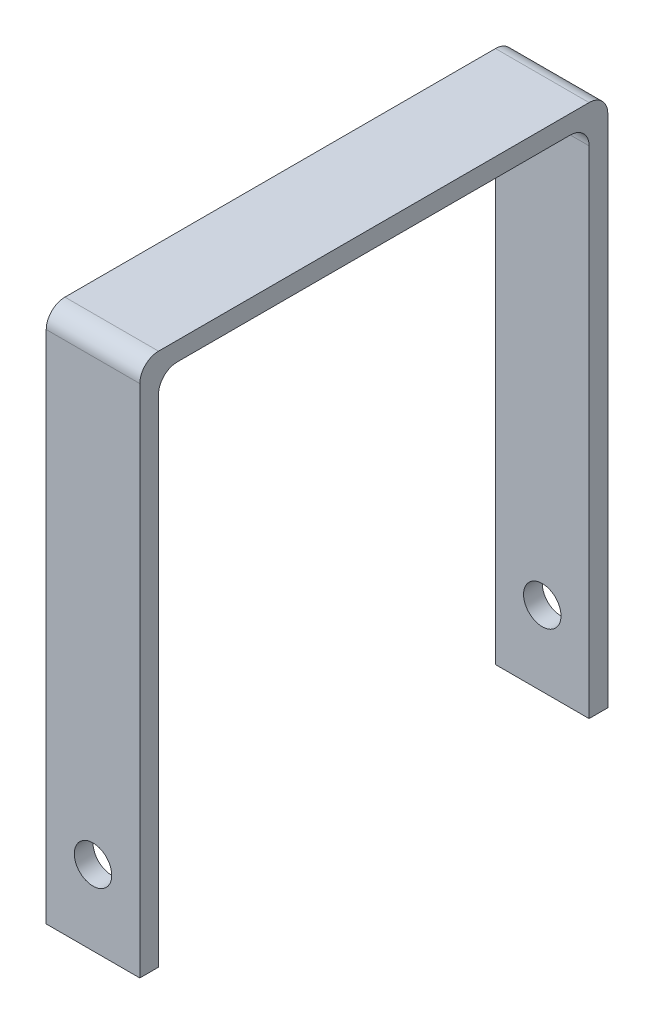
ISO-10303-21;
HEADER;
FILE_DESCRIPTION(('STEP AP214'),'2;1');
FILE_NAME('part.step','',(''),(''),'','','');
FILE_SCHEMA(('AUTOMOTIVE_DESIGN { 1 0 10303 214 1 1 1 1 }'));
ENDSEC;
DATA;
#1=APPLICATION_CONTEXT('core data for automotive mechanical design processes');
#2=APPLICATION_PROTOCOL_DEFINITION('international standard','automotive_design',2000,#1);
#3=PRODUCT_CONTEXT('',#1,'mechanical');
#4=PRODUCT('Part','Part','',(#3));
#5=PRODUCT_RELATED_PRODUCT_CATEGORY('part','',(#4));
#6=PRODUCT_DEFINITION_FORMATION('','',#4);
#7=PRODUCT_DEFINITION_CONTEXT('part definition',#1,'design');
#8=PRODUCT_DEFINITION('design','',#6,#7);
#9=PRODUCT_DEFINITION_SHAPE('','',#8);
#10=(LENGTH_UNIT() NAMED_UNIT(*) SI_UNIT(.MILLI.,.METRE.));
#11=(NAMED_UNIT(*) PLANE_ANGLE_UNIT() SI_UNIT($,.RADIAN.));
#12=(NAMED_UNIT(*) SI_UNIT($,.STERADIAN.) SOLID_ANGLE_UNIT());
#13=UNCERTAINTY_MEASURE_WITH_UNIT(LENGTH_MEASURE(1.E-05),#10,'distance_accuracy_value','');
#14=(GEOMETRIC_REPRESENTATION_CONTEXT(3) GLOBAL_UNCERTAINTY_ASSIGNED_CONTEXT((#13)) GLOBAL_UNIT_ASSIGNED_CONTEXT((#10,
#11,#12)) REPRESENTATION_CONTEXT('',''));
#15=CARTESIAN_POINT('',(0.,0.,0.));
#16=DIRECTION('',(0.,0.,1.));
#17=DIRECTION('',(1.,0.,0.));
#18=AXIS2_PLACEMENT_3D('',#15,#16,#17);
#19=CARTESIAN_POINT('',(10.,0.,0.));
#20=DIRECTION('',(0.,1.,0.));
#21=DIRECTION('',(0.,0.,1.));
#22=AXIS2_PLACEMENT_3D('',#19,#20,#21);
#23=PLANE('',#22);
#24=DIRECTION('',(0.,0.,-1.));
#25=VECTOR('',#24,1.);
#26=CARTESIAN_POINT('',(0.,0.,0.));
#27=LINE('',#26,#25);
#28=CARTESIAN_POINT('',(0.,0.,0.));
#29=VERTEX_POINT('',#28);
#30=CARTESIAN_POINT('',(0.,0.,-2.));
#31=VERTEX_POINT('',#30);
#32=EDGE_CURVE('E155',#29,#31,#27,.T.);
#33=ORIENTED_EDGE('',*,*,#32,.T.);
#34=DIRECTION('',(-1.,0.,0.));
#35=VECTOR('',#34,1.);
#36=CARTESIAN_POINT('',(10.,0.,-2.));
#37=LINE('',#36,#35);
#38=CARTESIAN_POINT('',(10.,0.,-2.));
#39=VERTEX_POINT('',#38);
#40=EDGE_CURVE('E11',#39,#31,#37,.T.);
#41=ORIENTED_EDGE('',*,*,#40,.F.);
#42=DIRECTION('',(0.,0.,-1.));
#43=VECTOR('',#42,1.);
#44=CARTESIAN_POINT('',(10.,0.,0.));
#45=LINE('',#44,#43);
#46=CARTESIAN_POINT('',(10.,0.,0.));
#47=VERTEX_POINT('',#46);
#48=EDGE_CURVE('E178',#47,#39,#45,.T.);
#49=ORIENTED_EDGE('',*,*,#48,.F.);
#50=DIRECTION('',(-1.,0.,0.));
#51=VECTOR('',#50,1.);
#52=CARTESIAN_POINT('',(10.,0.,0.));
#53=LINE('',#52,#51);
#54=EDGE_CURVE('E151',#47,#29,#53,.T.);
#55=ORIENTED_EDGE('',*,*,#54,.T.);
#56=EDGE_LOOP('',(#33,#41,#49,#55));
#57=FACE_BOUND('',#56,.T.);
#58=ADVANCED_FACE('F35',(#57),#23,.F.);
#59=CARTESIAN_POINT('',(10.,0.,-2.));
#60=DIRECTION('',(0.,0.,1.));
#61=DIRECTION('',(1.,0.,0.));
#62=AXIS2_PLACEMENT_3D('',#59,#60,#61);
#63=PLANE('',#62);
#64=CARTESIAN_POINT('',(5.,8.,-2.));
#65=DIRECTION('',(0.,0.,1.));
#66=DIRECTION('',(1.,0.,0.));
#67=AXIS2_PLACEMENT_3D('',#64,#65,#66);
#68=CIRCLE('',#67,2.);
#69=CARTESIAN_POINT('',(7.,8.,-2.));
#70=VERTEX_POINT('',#69);
#71=EDGE_CURVE('E159',#70,#70,#68,.T.);
#72=ORIENTED_EDGE('',*,*,#71,.T.);
#73=EDGE_LOOP('',(#72));
#74=FACE_BOUND('',#73,.T.);
#75=DIRECTION('',(0.,1.,0.));
#76=VECTOR('',#75,1.);
#77=CARTESIAN_POINT('',(0.,0.,-2.));
#78=LINE('',#77,#76);
#79=CARTESIAN_POINT('',(0.,53.,-2.));
#80=VERTEX_POINT('',#79);
#81=EDGE_CURVE('E158',#31,#80,#78,.T.);
#82=ORIENTED_EDGE('',*,*,#81,.T.);
#83=DIRECTION('',(-1.,0.,0.));
#84=VECTOR('',#83,1.);
#85=CARTESIAN_POINT('',(10.,53.,-2.));
#86=LINE('',#85,#84);
#87=CARTESIAN_POINT('',(10.,53.,-2.));
#88=VERTEX_POINT('',#87);
#89=EDGE_CURVE('E43',#88,#80,#86,.T.);
#90=ORIENTED_EDGE('',*,*,#89,.F.);
#91=DIRECTION('',(0.,1.,0.));
#92=VECTOR('',#91,1.);
#93=CARTESIAN_POINT('',(10.,0.,-2.));
#94=LINE('',#93,#92);
#95=EDGE_CURVE('E106',#39,#88,#94,.T.);
#96=ORIENTED_EDGE('',*,*,#95,.F.);
#97=ORIENTED_EDGE('',*,*,#40,.T.);
#98=EDGE_LOOP('',(#82,#90,#96,#97));
#99=FACE_BOUND('',#98,.T.);
#100=ADVANCED_FACE('F258',(#74,#99),#63,.F.);
#101=CARTESIAN_POINT('',(10.,53.,-4.));
#102=DIRECTION('',(-1.,0.,0.));
#103=DIRECTION('',(0.,0.,1.));
#104=AXIS2_PLACEMENT_3D('',#101,#102,#103);
#105=CYLINDRICAL_SURFACE('',#104,2.);
#106=CARTESIAN_POINT('',(0.,53.,-4.));
#107=DIRECTION('',(-1.,0.,0.));
#108=DIRECTION('',(0.,0.,1.));
#109=AXIS2_PLACEMENT_3D('',#106,#107,#108);
#110=CIRCLE('',#109,2.);
#111=CARTESIAN_POINT('',(0.,55.,-4.));
#112=VERTEX_POINT('',#111);
#113=EDGE_CURVE('E161',#80,#112,#110,.T.);
#114=ORIENTED_EDGE('',*,*,#113,.T.);
#115=DIRECTION('',(-1.,0.,0.));
#116=VECTOR('',#115,1.);
#117=CARTESIAN_POINT('',(10.,55.,-4.));
#118=LINE('',#117,#116);
#119=CARTESIAN_POINT('',(10.,55.,-4.));
#120=VERTEX_POINT('',#119);
#121=EDGE_CURVE('E197',#120,#112,#118,.T.);
#122=ORIENTED_EDGE('',*,*,#121,.F.);
#123=CARTESIAN_POINT('',(10.,53.,-4.));
#124=DIRECTION('',(-1.,0.,0.));
#125=DIRECTION('',(0.,0.,1.));
#126=AXIS2_PLACEMENT_3D('',#123,#124,#125);
#127=CIRCLE('',#126,2.);
#128=EDGE_CURVE('E205',#88,#120,#127,.T.);
#129=ORIENTED_EDGE('',*,*,#128,.F.);
#130=ORIENTED_EDGE('',*,*,#89,.T.);
#131=EDGE_LOOP('',(#114,#122,#129,#130));
#132=FACE_BOUND('',#131,.T.);
#133=ADVANCED_FACE('F203',(#132),#105,.F.);
#134=CARTESIAN_POINT('',(10.,55.,-4.));
#135=DIRECTION('',(0.,1.,0.));
#136=DIRECTION('',(0.,0.,1.));
#137=AXIS2_PLACEMENT_3D('',#134,#135,#136);
#138=PLANE('',#137);
#139=DIRECTION('',(0.,0.,-1.));
#140=VECTOR('',#139,1.);
#141=CARTESIAN_POINT('',(0.,55.,-4.));
#142=LINE('',#141,#140);
#143=CARTESIAN_POINT('',(0.,55.,-46.));
#144=VERTEX_POINT('',#143);
#145=EDGE_CURVE('E163',#112,#144,#142,.T.);
#146=ORIENTED_EDGE('',*,*,#145,.T.);
#147=DIRECTION('',(-1.,0.,0.));
#148=VECTOR('',#147,1.);
#149=CARTESIAN_POINT('',(10.,55.,-46.));
#150=LINE('',#149,#148);
#151=CARTESIAN_POINT('',(10.,55.,-46.));
#152=VERTEX_POINT('',#151);
#153=EDGE_CURVE('E194',#152,#144,#150,.T.);
#154=ORIENTED_EDGE('',*,*,#153,.F.);
#155=DIRECTION('',(0.,0.,-1.));
#156=VECTOR('',#155,1.);
#157=CARTESIAN_POINT('',(10.,55.,-4.));
#158=LINE('',#157,#156);
#159=EDGE_CURVE('E223',#120,#152,#158,.T.);
#160=ORIENTED_EDGE('',*,*,#159,.F.);
#161=ORIENTED_EDGE('',*,*,#121,.T.);
#162=EDGE_LOOP('',(#146,#154,#160,#161));
#163=FACE_BOUND('',#162,.T.);
#164=ADVANCED_FACE('F214',(#163),#138,.F.);
#165=CARTESIAN_POINT('',(10.,53.,-46.));
#166=DIRECTION('',(-1.,0.,0.));
#167=DIRECTION('',(0.,0.,1.));
#168=AXIS2_PLACEMENT_3D('',#165,#166,#167);
#169=CYLINDRICAL_SURFACE('',#168,2.00000000000001);
#170=CARTESIAN_POINT('',(0.,53.,-46.));
#171=DIRECTION('',(-1.,0.,0.));
#172=DIRECTION('',(0.,0.,-1.));
#173=AXIS2_PLACEMENT_3D('',#170,#171,#172);
#174=CIRCLE('',#173,2.00000000000001);
#175=CARTESIAN_POINT('',(0.,53.,-48.));
#176=VERTEX_POINT('',#175);
#177=EDGE_CURVE('E165',#144,#176,#174,.T.);
#178=ORIENTED_EDGE('',*,*,#177,.T.);
#179=DIRECTION('',(-1.,0.,0.));
#180=VECTOR('',#179,1.);
#181=CARTESIAN_POINT('',(10.,53.,-48.));
#182=LINE('',#181,#180);
#183=CARTESIAN_POINT('',(10.,53.,-48.));
#184=VERTEX_POINT('',#183);
#185=EDGE_CURVE('E191',#184,#176,#182,.T.);
#186=ORIENTED_EDGE('',*,*,#185,.F.);
#187=CARTESIAN_POINT('',(10.,53.,-46.));
#188=DIRECTION('',(-1.,0.,0.));
#189=DIRECTION('',(0.,0.,-1.));
#190=AXIS2_PLACEMENT_3D('',#187,#188,#189);
#191=CIRCLE('',#190,2.00000000000001);
#192=EDGE_CURVE('E220',#152,#184,#191,.T.);
#193=ORIENTED_EDGE('',*,*,#192,.F.);
#194=ORIENTED_EDGE('',*,*,#153,.T.);
#195=EDGE_LOOP('',(#178,#186,#193,#194));
#196=FACE_BOUND('',#195,.T.);
#197=ADVANCED_FACE('F218',(#196),#169,.F.);
#198=CARTESIAN_POINT('',(10.,0.,-48.));
#199=DIRECTION('',(0.,0.,-1.));
#200=DIRECTION('',(0.,1.,0.));
#201=AXIS2_PLACEMENT_3D('',#198,#199,#200);
#202=PLANE('',#201);
#203=CARTESIAN_POINT('',(5.,8.,-48.));
#204=DIRECTION('',(0.,0.,-1.));
#205=DIRECTION('',(0.,1.,0.));
#206=AXIS2_PLACEMENT_3D('',#203,#204,#205);
#207=CIRCLE('',#206,2.);
#208=CARTESIAN_POINT('',(5.,10.,-48.));
#209=VERTEX_POINT('',#208);
#210=EDGE_CURVE('E362',#209,#209,#207,.T.);
#211=ORIENTED_EDGE('',*,*,#210,.T.);
#212=EDGE_LOOP('',(#211));
#213=FACE_BOUND('',#212,.T.);
#214=DIRECTION('',(0.,-1.,0.));
#215=VECTOR('',#214,1.);
#216=CARTESIAN_POINT('',(0.,0.,-48.));
#217=LINE('',#216,#215);
#218=CARTESIAN_POINT('',(0.,0.,-48.));
#219=VERTEX_POINT('',#218);
#220=EDGE_CURVE('E167',#176,#219,#217,.T.);
#221=ORIENTED_EDGE('',*,*,#220,.T.);
#222=DIRECTION('',(-1.,0.,0.));
#223=VECTOR('',#222,1.);
#224=CARTESIAN_POINT('',(10.,0.,-48.));
#225=LINE('',#224,#223);
#226=CARTESIAN_POINT('',(10.,0.,-48.));
#227=VERTEX_POINT('',#226);
#228=EDGE_CURVE('E188',#227,#219,#225,.T.);
#229=ORIENTED_EDGE('',*,*,#228,.F.);
#230=DIRECTION('',(0.,-1.,0.));
#231=VECTOR('',#230,1.);
#232=CARTESIAN_POINT('',(10.,0.,-48.));
#233=LINE('',#232,#231);
#234=EDGE_CURVE('E222',#184,#227,#233,.T.);
#235=ORIENTED_EDGE('',*,*,#234,.F.);
#236=ORIENTED_EDGE('',*,*,#185,.T.);
#237=EDGE_LOOP('',(#221,#229,#235,#236));
#238=FACE_BOUND('',#237,.T.);
#239=ADVANCED_FACE('F273',(#213,#238),#202,.F.);
#240=CARTESIAN_POINT('',(10.,0.,-50.));
#241=DIRECTION('',(0.,1.,0.));
#242=DIRECTION('',(0.,0.,1.));
#243=AXIS2_PLACEMENT_3D('',#240,#241,#242);
#244=PLANE('',#243);
#245=DIRECTION('',(0.,0.,-1.));
#246=VECTOR('',#245,1.);
#247=CARTESIAN_POINT('',(0.,0.,-50.));
#248=LINE('',#247,#246);
#249=CARTESIAN_POINT('',(0.,0.,-50.));
#250=VERTEX_POINT('',#249);
#251=EDGE_CURVE('E169',#219,#250,#248,.T.);
#252=ORIENTED_EDGE('',*,*,#251,.T.);
#253=DIRECTION('',(-1.,0.,0.));
#254=VECTOR('',#253,1.);
#255=CARTESIAN_POINT('',(10.,0.,-50.));
#256=LINE('',#255,#254);
#257=CARTESIAN_POINT('',(10.,0.,-50.));
#258=VERTEX_POINT('',#257);
#259=EDGE_CURVE('E185',#258,#250,#256,.T.);
#260=ORIENTED_EDGE('',*,*,#259,.F.);
#261=DIRECTION('',(0.,0.,-1.));
#262=VECTOR('',#261,1.);
#263=CARTESIAN_POINT('',(10.,0.,-50.));
#264=LINE('',#263,#262);
#265=EDGE_CURVE('E225',#227,#258,#264,.T.);
#266=ORIENTED_EDGE('',*,*,#265,.F.);
#267=ORIENTED_EDGE('',*,*,#228,.T.);
#268=EDGE_LOOP('',(#252,#260,#266,#267));
#269=FACE_BOUND('',#268,.T.);
#270=ADVANCED_FACE('F276',(#269),#244,.F.);
#271=CARTESIAN_POINT('',(10.,0.,-50.));
#272=DIRECTION('',(0.,0.,1.));
#273=DIRECTION('',(0.,-1.,0.));
#274=AXIS2_PLACEMENT_3D('',#271,#272,#273);
#275=PLANE('',#274);
#276=CARTESIAN_POINT('',(5.,8.,-50.));
#277=DIRECTION('',(0.,0.,1.));
#278=DIRECTION('',(1.,0.,0.));
#279=AXIS2_PLACEMENT_3D('',#276,#277,#278);
#280=CIRCLE('',#279,2.);
#281=CARTESIAN_POINT('',(7.,8.,-50.));
#282=VERTEX_POINT('',#281);
#283=EDGE_CURVE('E359',#282,#282,#280,.T.);
#284=ORIENTED_EDGE('',*,*,#283,.T.);
#285=EDGE_LOOP('',(#284));
#286=FACE_BOUND('',#285,.T.);
#287=DIRECTION('',(0.,1.,0.));
#288=VECTOR('',#287,1.);
#289=CARTESIAN_POINT('',(0.,0.,-50.));
#290=LINE('',#289,#288);
#291=CARTESIAN_POINT('',(0.,55.,-50.));
#292=VERTEX_POINT('',#291);
#293=EDGE_CURVE('E171',#250,#292,#290,.T.);
#294=ORIENTED_EDGE('',*,*,#293,.T.);
#295=DIRECTION('',(-1.,0.,0.));
#296=VECTOR('',#295,1.);
#297=CARTESIAN_POINT('',(10.,55.,-50.));
#298=LINE('',#297,#296);
#299=CARTESIAN_POINT('',(10.,55.,-50.));
#300=VERTEX_POINT('',#299);
#301=EDGE_CURVE('E182',#300,#292,#298,.T.);
#302=ORIENTED_EDGE('',*,*,#301,.F.);
#303=DIRECTION('',(0.,1.,0.));
#304=VECTOR('',#303,1.);
#305=CARTESIAN_POINT('',(10.,0.,-50.));
#306=LINE('',#305,#304);
#307=EDGE_CURVE('E231',#258,#300,#306,.T.);
#308=ORIENTED_EDGE('',*,*,#307,.F.);
#309=ORIENTED_EDGE('',*,*,#259,.T.);
#310=EDGE_LOOP('',(#294,#302,#308,#309));
#311=FACE_BOUND('',#310,.T.);
#312=ADVANCED_FACE('F237',(#286,#311),#275,.F.);
#313=CARTESIAN_POINT('',(10.,55.,-48.));
#314=DIRECTION('',(-1.,0.,0.));
#315=DIRECTION('',(0.,0.,1.));
#316=AXIS2_PLACEMENT_3D('',#313,#314,#315);
#317=CYLINDRICAL_SURFACE('',#316,2.);
#318=CARTESIAN_POINT('',(0.,55.,-48.));
#319=DIRECTION('',(1.,0.,0.));
#320=DIRECTION('',(0.,0.,-1.));
#321=AXIS2_PLACEMENT_3D('',#318,#319,#320);
#322=CIRCLE('',#321,2.);
#323=CARTESIAN_POINT('',(0.,57.,-48.));
#324=VERTEX_POINT('',#323);
#325=EDGE_CURVE('E173',#292,#324,#322,.T.);
#326=ORIENTED_EDGE('',*,*,#325,.T.);
#327=DIRECTION('',(-1.,0.,0.));
#328=VECTOR('',#327,1.);
#329=CARTESIAN_POINT('',(10.,57.,-48.));
#330=LINE('',#329,#328);
#331=CARTESIAN_POINT('',(10.,57.,-48.));
#332=VERTEX_POINT('',#331);
#333=EDGE_CURVE('E146',#332,#324,#330,.T.);
#334=ORIENTED_EDGE('',*,*,#333,.F.);
#335=CARTESIAN_POINT('',(10.,55.,-48.));
#336=DIRECTION('',(1.,0.,0.));
#337=DIRECTION('',(0.,0.,-1.));
#338=AXIS2_PLACEMENT_3D('',#335,#336,#337);
#339=CIRCLE('',#338,2.);
#340=EDGE_CURVE('E137',#300,#332,#339,.T.);
#341=ORIENTED_EDGE('',*,*,#340,.F.);
#342=ORIENTED_EDGE('',*,*,#301,.T.);
#343=EDGE_LOOP('',(#326,#334,#341,#342));
#344=FACE_BOUND('',#343,.T.);
#345=ADVANCED_FACE('F241',(#344),#317,.T.);
#346=CARTESIAN_POINT('',(10.,57.,-2.));
#347=DIRECTION('',(0.,-1.,0.));
#348=DIRECTION('',(0.,0.,-1.));
#349=AXIS2_PLACEMENT_3D('',#346,#347,#348);
#350=PLANE('',#349);
#351=DIRECTION('',(0.,0.,1.));
#352=VECTOR('',#351,1.);
#353=CARTESIAN_POINT('',(0.,57.,-2.));
#354=LINE('',#353,#352);
#355=CARTESIAN_POINT('',(0.,57.,-2.));
#356=VERTEX_POINT('',#355);
#357=EDGE_CURVE('E145',#324,#356,#354,.T.);
#358=ORIENTED_EDGE('',*,*,#357,.T.);
#359=DIRECTION('',(-1.,0.,0.));
#360=VECTOR('',#359,1.);
#361=CARTESIAN_POINT('',(10.,57.,-2.));
#362=LINE('',#361,#360);
#363=CARTESIAN_POINT('',(10.,57.,-2.));
#364=VERTEX_POINT('',#363);
#365=EDGE_CURVE('E142',#364,#356,#362,.T.);
#366=ORIENTED_EDGE('',*,*,#365,.F.);
#367=DIRECTION('',(0.,0.,1.));
#368=VECTOR('',#367,1.);
#369=CARTESIAN_POINT('',(10.,57.,-2.));
#370=LINE('',#369,#368);
#371=EDGE_CURVE('E131',#332,#364,#370,.T.);
#372=ORIENTED_EDGE('',*,*,#371,.F.);
#373=ORIENTED_EDGE('',*,*,#333,.T.);
#374=EDGE_LOOP('',(#358,#366,#372,#373));
#375=FACE_BOUND('',#374,.T.);
#376=ADVANCED_FACE('F143',(#375),#350,.F.);
#377=CARTESIAN_POINT('',(10.,55.,-2.));
#378=DIRECTION('',(-1.,0.,0.));
#379=DIRECTION('',(0.,0.,1.));
#380=AXIS2_PLACEMENT_3D('',#377,#378,#379);
#381=CYLINDRICAL_SURFACE('',#380,2.);
#382=CARTESIAN_POINT('',(0.,55.,-2.));
#383=DIRECTION('',(1.,0.,0.));
#384=DIRECTION('',(0.,0.,1.));
#385=AXIS2_PLACEMENT_3D('',#382,#383,#384);
#386=CIRCLE('',#385,2.);
#387=CARTESIAN_POINT('',(0.,55.,0.));
#388=VERTEX_POINT('',#387);
#389=EDGE_CURVE('E92',#356,#388,#386,.T.);
#390=ORIENTED_EDGE('',*,*,#389,.T.);
#391=DIRECTION('',(-1.,0.,0.));
#392=VECTOR('',#391,1.);
#393=CARTESIAN_POINT('',(10.,55.,0.));
#394=LINE('',#393,#392);
#395=CARTESIAN_POINT('',(10.,55.,0.));
#396=VERTEX_POINT('',#395);
#397=EDGE_CURVE('E147',#396,#388,#394,.T.);
#398=ORIENTED_EDGE('',*,*,#397,.F.);
#399=CARTESIAN_POINT('',(10.,55.,-2.));
#400=DIRECTION('',(1.,0.,0.));
#401=DIRECTION('',(0.,0.,1.));
#402=AXIS2_PLACEMENT_3D('',#399,#400,#401);
#403=CIRCLE('',#402,2.);
#404=EDGE_CURVE('E135',#364,#396,#403,.T.);
#405=ORIENTED_EDGE('',*,*,#404,.F.);
#406=ORIENTED_EDGE('',*,*,#365,.T.);
#407=EDGE_LOOP('',(#390,#398,#405,#406));
#408=FACE_BOUND('',#407,.T.);
#409=ADVANCED_FACE('F149',(#408),#381,.T.);
#410=CARTESIAN_POINT('',(10.,0.,0.));
#411=DIRECTION('',(0.,0.,-1.));
#412=DIRECTION('',(-1.,0.,0.));
#413=AXIS2_PLACEMENT_3D('',#410,#411,#412);
#414=PLANE('',#413);
#415=CARTESIAN_POINT('',(5.,8.,0.));
#416=DIRECTION('',(0.,0.,1.));
#417=DIRECTION('',(1.,0.,0.));
#418=AXIS2_PLACEMENT_3D('',#415,#416,#417);
#419=CIRCLE('',#418,2.);
#420=CARTESIAN_POINT('',(7.,8.,0.));
#421=VERTEX_POINT('',#420);
#422=EDGE_CURVE('E365',#421,#421,#419,.T.);
#423=ORIENTED_EDGE('',*,*,#422,.F.);
#424=EDGE_LOOP('',(#423));
#425=FACE_BOUND('',#424,.T.);
#426=DIRECTION('',(0.,-1.,0.));
#427=VECTOR('',#426,1.);
#428=CARTESIAN_POINT('',(0.,0.,0.));
#429=LINE('',#428,#427);
#430=EDGE_CURVE('E98',#388,#29,#429,.T.);
#431=ORIENTED_EDGE('',*,*,#430,.T.);
#432=ORIENTED_EDGE('',*,*,#54,.F.);
#433=DIRECTION('',(0.,-1.,0.));
#434=VECTOR('',#433,1.);
#435=CARTESIAN_POINT('',(10.,0.,0.));
#436=LINE('',#435,#434);
#437=EDGE_CURVE('E51',#396,#47,#436,.T.);
#438=ORIENTED_EDGE('',*,*,#437,.F.);
#439=ORIENTED_EDGE('',*,*,#397,.T.);
#440=EDGE_LOOP('',(#431,#432,#438,#439));
#441=FACE_BOUND('',#440,.T.);
#442=ADVANCED_FACE('F245',(#425,#441),#414,.F.);
#443=CARTESIAN_POINT('',(10.,53.,-4.));
#444=DIRECTION('',(-1.,0.,0.));
#445=DIRECTION('',(0.,0.,1.));
#446=AXIS2_PLACEMENT_3D('',#443,#444,#445);
#447=PLANE('',#446);
#448=ORIENTED_EDGE('',*,*,#48,.T.);
#449=ORIENTED_EDGE('',*,*,#95,.T.);
#450=ORIENTED_EDGE('',*,*,#128,.T.);
#451=ORIENTED_EDGE('',*,*,#159,.T.);
#452=ORIENTED_EDGE('',*,*,#192,.T.);
#453=ORIENTED_EDGE('',*,*,#234,.T.);
#454=ORIENTED_EDGE('',*,*,#265,.T.);
#455=ORIENTED_EDGE('',*,*,#307,.T.);
#456=ORIENTED_EDGE('',*,*,#340,.T.);
#457=ORIENTED_EDGE('',*,*,#371,.T.);
#458=ORIENTED_EDGE('',*,*,#404,.T.);
#459=ORIENTED_EDGE('',*,*,#437,.T.);
#460=EDGE_LOOP('',(#448,#449,#450,#451,#452,#453,#454,#455,#456,#457,#458,#459));
#461=FACE_BOUND('',#460,.T.);
#462=ADVANCED_FACE('F133',(#461),#447,.F.);
#463=CARTESIAN_POINT('',(0.,53.,-4.));
#464=DIRECTION('',(-1.,0.,0.));
#465=DIRECTION('',(0.,0.,1.));
#466=AXIS2_PLACEMENT_3D('',#463,#464,#465);
#467=PLANE('',#466);
#468=ORIENTED_EDGE('',*,*,#32,.F.);
#469=ORIENTED_EDGE('',*,*,#430,.F.);
#470=ORIENTED_EDGE('',*,*,#389,.F.);
#471=ORIENTED_EDGE('',*,*,#357,.F.);
#472=ORIENTED_EDGE('',*,*,#325,.F.);
#473=ORIENTED_EDGE('',*,*,#293,.F.);
#474=ORIENTED_EDGE('',*,*,#251,.F.);
#475=ORIENTED_EDGE('',*,*,#220,.F.);
#476=ORIENTED_EDGE('',*,*,#177,.F.);
#477=ORIENTED_EDGE('',*,*,#145,.F.);
#478=ORIENTED_EDGE('',*,*,#113,.F.);
#479=ORIENTED_EDGE('',*,*,#81,.F.);
#480=EDGE_LOOP('',(#468,#469,#470,#471,#472,#473,#474,#475,#476,#477,#478,#479));
#481=FACE_BOUND('',#480,.T.);
#482=ADVANCED_FACE('F209',(#481),#467,.T.);
#483=CARTESIAN_POINT('',(5.,8.,-50.));
#484=DIRECTION('',(0.,0.,1.));
#485=DIRECTION('',(1.,0.,0.));
#486=AXIS2_PLACEMENT_3D('',#483,#484,#485);
#487=CYLINDRICAL_SURFACE('',#486,2.);
#488=ORIENTED_EDGE('',*,*,#422,.T.);
#489=EDGE_LOOP('',(#488));
#490=FACE_BOUND('',#489,.T.);
#491=ORIENTED_EDGE('',*,*,#71,.F.);
#492=EDGE_LOOP('',(#491));
#493=FACE_BOUND('',#492,.T.);
#494=ADVANCED_FACE('F310',(#490,#493),#487,.F.);
#495=ORIENTED_EDGE('',*,*,#283,.F.);
#496=EDGE_LOOP('',(#495));
#497=FACE_BOUND('',#496,.T.);
#498=ORIENTED_EDGE('',*,*,#210,.F.);
#499=EDGE_LOOP('',(#498));
#500=FACE_BOUND('',#499,.T.);
#501=ADVANCED_FACE('F343',(#497,#500),#487,.F.);
#502=CLOSED_SHELL('',(#58,#100,#133,#164,#197,#239,#270,#312,#345,#376,#409,#442,#462,#482,#494,#501));
#503=MANIFOLD_SOLID_BREP('B2',#502);
#504=ADVANCED_BREP_SHAPE_REPRESENTATION('',(#18,#503),#14);
#505=SHAPE_DEFINITION_REPRESENTATION(#9,#504);
ENDSEC;
END-ISO-10303-21;
